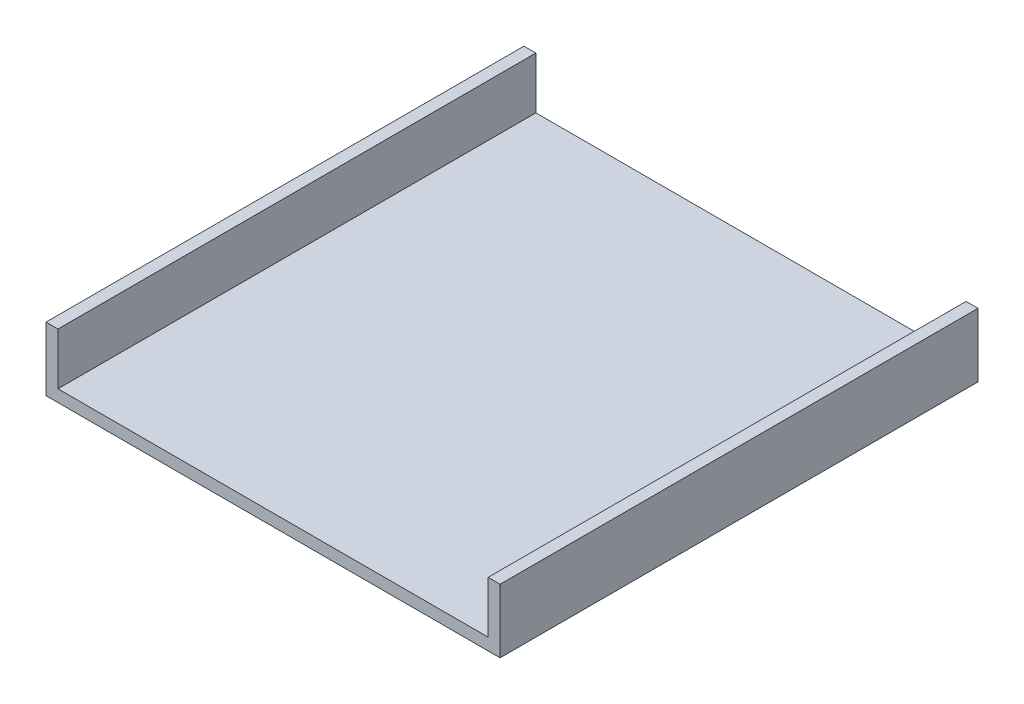
ISO-10303-21;
HEADER;
FILE_DESCRIPTION(('STEP AP214'),'2;1');
FILE_NAME('part.step','',(''),(''),'','','');
FILE_SCHEMA(('AUTOMOTIVE_DESIGN { 1 0 10303 214 1 1 1 1 }'));
ENDSEC;
DATA;
#1=APPLICATION_CONTEXT('core data for automotive mechanical design processes');
#2=APPLICATION_PROTOCOL_DEFINITION('international standard','automotive_design',2000,#1);
#3=PRODUCT_CONTEXT('',#1,'mechanical');
#4=PRODUCT('Part','Part','',(#3));
#5=PRODUCT_RELATED_PRODUCT_CATEGORY('part','',(#4));
#6=PRODUCT_DEFINITION_FORMATION('','',#4);
#7=PRODUCT_DEFINITION_CONTEXT('part definition',#1,'design');
#8=PRODUCT_DEFINITION('design','',#6,#7);
#9=PRODUCT_DEFINITION_SHAPE('','',#8);
#10=(LENGTH_UNIT() NAMED_UNIT(*) SI_UNIT(.MILLI.,.METRE.));
#11=(NAMED_UNIT(*) PLANE_ANGLE_UNIT() SI_UNIT($,.RADIAN.));
#12=(NAMED_UNIT(*) SI_UNIT($,.STERADIAN.) SOLID_ANGLE_UNIT());
#13=UNCERTAINTY_MEASURE_WITH_UNIT(LENGTH_MEASURE(1.E-05),#10,'distance_accuracy_value','');
#14=(GEOMETRIC_REPRESENTATION_CONTEXT(3) GLOBAL_UNCERTAINTY_ASSIGNED_CONTEXT((#13)) GLOBAL_UNIT_ASSIGNED_CONTEXT((#10,
#11,#12)) REPRESENTATION_CONTEXT('',''));
#15=CARTESIAN_POINT('',(0.,0.,0.));
#16=DIRECTION('',(0.,0.,1.));
#17=DIRECTION('',(1.,0.,0.));
#18=AXIS2_PLACEMENT_3D('',#15,#16,#17);
#19=CARTESIAN_POINT('',(57.,8.00000000000001,-60.));
#20=DIRECTION('',(0.,1.,0.));
#21=DIRECTION('',(-1.,0.,0.));
#22=AXIS2_PLACEMENT_3D('',#19,#20,#21);
#23=PLANE('',#22);
#24=DIRECTION('',(0.,0.,-1.));
#25=VECTOR('',#24,1.);
#26=CARTESIAN_POINT('',(54.,8.00000000000001,-60.));
#27=LINE('',#26,#25);
#28=CARTESIAN_POINT('',(54.,8.00000000000001,60.));
#29=VERTEX_POINT('',#28);
#30=CARTESIAN_POINT('',(54.,8.00000000000001,-60.));
#31=VERTEX_POINT('',#30);
#32=EDGE_CURVE('E130',#29,#31,#27,.T.);
#33=ORIENTED_EDGE('',*,*,#32,.F.);
#34=DIRECTION('',(-1.,0.,0.));
#35=VECTOR('',#34,1.);
#36=CARTESIAN_POINT('',(57.,8.00000000000001,60.));
#37=LINE('',#36,#35);
#38=CARTESIAN_POINT('',(57.,8.00000000000001,60.));
#39=VERTEX_POINT('',#38);
#40=EDGE_CURVE('E142',#39,#29,#37,.T.);
#41=ORIENTED_EDGE('',*,*,#40,.F.);
#42=DIRECTION('',(0.,0.,1.));
#43=VECTOR('',#42,1.);
#44=CARTESIAN_POINT('',(57.,8.00000000000001,-60.));
#45=LINE('',#44,#43);
#46=CARTESIAN_POINT('',(57.,8.00000000000001,-60.));
#47=VERTEX_POINT('',#46);
#48=EDGE_CURVE('E159',#47,#39,#45,.T.);
#49=ORIENTED_EDGE('',*,*,#48,.F.);
#50=DIRECTION('',(-1.,0.,0.));
#51=VECTOR('',#50,1.);
#52=CARTESIAN_POINT('',(57.,8.00000000000001,-60.));
#53=LINE('',#52,#51);
#54=EDGE_CURVE('E154',#47,#31,#53,.T.);
#55=ORIENTED_EDGE('',*,*,#54,.T.);
#56=EDGE_LOOP('',(#33,#41,#49,#55));
#57=FACE_BOUND('',#56,.T.);
#58=ADVANCED_FACE('F38',(#57),#23,.T.);
#59=CARTESIAN_POINT('',(-57.,-8.00000000000001,-60.));
#60=DIRECTION('',(-1.,0.,0.));
#61=DIRECTION('',(0.,0.,1.));
#62=AXIS2_PLACEMENT_3D('',#59,#60,#61);
#63=PLANE('',#62);
#64=DIRECTION('',(0.,0.,1.));
#65=VECTOR('',#64,1.);
#66=CARTESIAN_POINT('',(-57.,-8.00000000000001,-60.));
#67=LINE('',#66,#65);
#68=CARTESIAN_POINT('',(-57.,-8.00000000000001,-60.));
#69=VERTEX_POINT('',#68);
#70=CARTESIAN_POINT('',(-57.,-8.00000000000001,60.));
#71=VERTEX_POINT('',#70);
#72=EDGE_CURVE('E157',#69,#71,#67,.T.);
#73=ORIENTED_EDGE('',*,*,#72,.T.);
#74=DIRECTION('',(0.,-1.,0.));
#75=VECTOR('',#74,1.);
#76=CARTESIAN_POINT('',(-57.,-8.00000000000001,60.));
#77=LINE('',#76,#75);
#78=CARTESIAN_POINT('',(-57.,7.99999999999999,60.));
#79=VERTEX_POINT('',#78);
#80=EDGE_CURVE('E132',#79,#71,#77,.T.);
#81=ORIENTED_EDGE('',*,*,#80,.F.);
#82=DIRECTION('',(0.,0.,1.));
#83=VECTOR('',#82,1.);
#84=CARTESIAN_POINT('',(-57.,7.99999999999999,-60.));
#85=LINE('',#84,#83);
#86=CARTESIAN_POINT('',(-57.,7.99999999999999,-60.));
#87=VERTEX_POINT('',#86);
#88=EDGE_CURVE('E46',#87,#79,#85,.T.);
#89=ORIENTED_EDGE('',*,*,#88,.F.);
#90=DIRECTION('',(0.,-1.,0.));
#91=VECTOR('',#90,1.);
#92=CARTESIAN_POINT('',(-57.,-8.00000000000001,-60.));
#93=LINE('',#92,#91);
#94=EDGE_CURVE('E145',#87,#69,#93,.T.);
#95=ORIENTED_EDGE('',*,*,#94,.T.);
#96=EDGE_LOOP('',(#73,#81,#89,#95));
#97=FACE_BOUND('',#96,.T.);
#98=ADVANCED_FACE('F40',(#97),#63,.T.);
#99=DIRECTION('',(0.,0.,1.));
#100=VECTOR('',#99,1.);
#101=CARTESIAN_POINT('',(-54.,7.99999999999999,-60.));
#102=LINE('',#101,#100);
#103=CARTESIAN_POINT('',(-54.,8.00000000000001,-60.));
#104=VERTEX_POINT('',#103);
#105=CARTESIAN_POINT('',(-54.,7.99999999999999,60.));
#106=VERTEX_POINT('',#105);
#107=EDGE_CURVE('E52',#104,#106,#102,.T.);
#108=ORIENTED_EDGE('',*,*,#107,.F.);
#109=EDGE_CURVE('E59',#104,#87,#53,.T.);
#110=ORIENTED_EDGE('',*,*,#109,.T.);
#111=ORIENTED_EDGE('',*,*,#88,.T.);
#112=EDGE_CURVE('E141',#106,#79,#37,.T.);
#113=ORIENTED_EDGE('',*,*,#112,.F.);
#114=EDGE_LOOP('',(#108,#110,#111,#113));
#115=FACE_BOUND('',#114,.T.);
#116=ADVANCED_FACE('F173',(#115),#23,.T.);
#117=CARTESIAN_POINT('',(57.,-7.99999999999999,-60.));
#118=DIRECTION('',(1.,0.,0.));
#119=DIRECTION('',(0.,0.,-1.));
#120=AXIS2_PLACEMENT_3D('',#117,#118,#119);
#121=PLANE('',#120);
#122=ORIENTED_EDGE('',*,*,#48,.T.);
#123=DIRECTION('',(0.,1.,0.));
#124=VECTOR('',#123,1.);
#125=CARTESIAN_POINT('',(57.,-7.99999999999999,60.));
#126=LINE('',#125,#124);
#127=CARTESIAN_POINT('',(57.,-7.99999999999999,60.));
#128=VERTEX_POINT('',#127);
#129=EDGE_CURVE('E138',#128,#39,#126,.T.);
#130=ORIENTED_EDGE('',*,*,#129,.F.);
#131=DIRECTION('',(0.,0.,1.));
#132=VECTOR('',#131,1.);
#133=CARTESIAN_POINT('',(57.,-7.99999999999999,-60.));
#134=LINE('',#133,#132);
#135=CARTESIAN_POINT('',(57.,-7.99999999999999,-60.));
#136=VERTEX_POINT('',#135);
#137=EDGE_CURVE('E161',#136,#128,#134,.T.);
#138=ORIENTED_EDGE('',*,*,#137,.F.);
#139=DIRECTION('',(0.,1.,0.));
#140=VECTOR('',#139,1.);
#141=CARTESIAN_POINT('',(57.,-7.99999999999999,-60.));
#142=LINE('',#141,#140);
#143=EDGE_CURVE('E151',#136,#47,#142,.T.);
#144=ORIENTED_EDGE('',*,*,#143,.T.);
#145=EDGE_LOOP('',(#122,#130,#138,#144));
#146=FACE_BOUND('',#145,.T.);
#147=ADVANCED_FACE('F177',(#146),#121,.T.);
#148=CARTESIAN_POINT('',(57.,-7.99999999999999,-60.));
#149=DIRECTION('',(0.,-1.,0.));
#150=DIRECTION('',(1.,0.,0.));
#151=AXIS2_PLACEMENT_3D('',#148,#149,#150);
#152=PLANE('',#151);
#153=ORIENTED_EDGE('',*,*,#137,.T.);
#154=DIRECTION('',(1.,0.,0.));
#155=VECTOR('',#154,1.);
#156=CARTESIAN_POINT('',(57.,-7.99999999999999,60.));
#157=LINE('',#156,#155);
#158=EDGE_CURVE('E135',#71,#128,#157,.T.);
#159=ORIENTED_EDGE('',*,*,#158,.F.);
#160=ORIENTED_EDGE('',*,*,#72,.F.);
#161=DIRECTION('',(1.,0.,0.));
#162=VECTOR('',#161,1.);
#163=CARTESIAN_POINT('',(57.,-7.99999999999999,-60.));
#164=LINE('',#163,#162);
#165=EDGE_CURVE('E148',#69,#136,#164,.T.);
#166=ORIENTED_EDGE('',*,*,#165,.T.);
#167=EDGE_LOOP('',(#153,#159,#160,#166));
#168=FACE_BOUND('',#167,.T.);
#169=ADVANCED_FACE('F167',(#168),#152,.T.);
#170=CARTESIAN_POINT('',(0.,0.,-60.));
#171=DIRECTION('',(0.,0.,1.));
#172=DIRECTION('',(1.,0.,0.));
#173=AXIS2_PLACEMENT_3D('',#170,#171,#172);
#174=PLANE('',#173);
#175=DIRECTION('',(1.,0.,0.));
#176=VECTOR('',#175,1.);
#177=CARTESIAN_POINT('',(-54.,-5.00000000000001,-60.));
#178=LINE('',#177,#176);
#179=CARTESIAN_POINT('',(-54.,-5.00000000000001,-60.));
#180=VERTEX_POINT('',#179);
#181=CARTESIAN_POINT('',(54.,-5.00000000000001,-60.));
#182=VERTEX_POINT('',#181);
#183=EDGE_CURVE('E110',#180,#182,#178,.T.);
#184=ORIENTED_EDGE('',*,*,#183,.T.);
#185=DIRECTION('',(0.,1.,0.));
#186=VECTOR('',#185,1.);
#187=CARTESIAN_POINT('',(54.,21.,-60.));
#188=LINE('',#187,#186);
#189=EDGE_CURVE('E120',#182,#31,#188,.T.);
#190=ORIENTED_EDGE('',*,*,#189,.T.);
#191=ORIENTED_EDGE('',*,*,#54,.F.);
#192=ORIENTED_EDGE('',*,*,#143,.F.);
#193=ORIENTED_EDGE('',*,*,#165,.F.);
#194=ORIENTED_EDGE('',*,*,#94,.F.);
#195=ORIENTED_EDGE('',*,*,#109,.F.);
#196=DIRECTION('',(0.,-1.,0.));
#197=VECTOR('',#196,1.);
#198=CARTESIAN_POINT('',(-54.,21.,-60.));
#199=LINE('',#198,#197);
#200=EDGE_CURVE('E105',#104,#180,#199,.T.);
#201=ORIENTED_EDGE('',*,*,#200,.T.);
#202=EDGE_LOOP('',(#184,#190,#191,#192,#193,#194,#195,#201));
#203=FACE_BOUND('',#202,.T.);
#204=ADVANCED_FACE('F118',(#203),#174,.F.);
#205=CARTESIAN_POINT('',(0.,0.,60.));
#206=DIRECTION('',(0.,0.,1.));
#207=DIRECTION('',(1.,0.,0.));
#208=AXIS2_PLACEMENT_3D('',#205,#206,#207);
#209=PLANE('',#208);
#210=DIRECTION('',(0.,1.,0.));
#211=VECTOR('',#210,1.);
#212=CARTESIAN_POINT('',(54.,21.,60.));
#213=LINE('',#212,#211);
#214=CARTESIAN_POINT('',(54.,-5.00000000000001,60.));
#215=VERTEX_POINT('',#214);
#216=EDGE_CURVE('E125',#215,#29,#213,.T.);
#217=ORIENTED_EDGE('',*,*,#216,.F.);
#218=DIRECTION('',(1.,0.,0.));
#219=VECTOR('',#218,1.);
#220=CARTESIAN_POINT('',(-54.,-5.00000000000001,60.));
#221=LINE('',#220,#219);
#222=CARTESIAN_POINT('',(-54.,-5.00000000000001,60.));
#223=VERTEX_POINT('',#222);
#224=EDGE_CURVE('E122',#223,#215,#221,.T.);
#225=ORIENTED_EDGE('',*,*,#224,.F.);
#226=DIRECTION('',(0.,-1.,0.));
#227=VECTOR('',#226,1.);
#228=CARTESIAN_POINT('',(-54.,0.,60.));
#229=LINE('',#228,#227);
#230=EDGE_CURVE('E11',#106,#223,#229,.T.);
#231=ORIENTED_EDGE('',*,*,#230,.F.);
#232=ORIENTED_EDGE('',*,*,#112,.T.);
#233=ORIENTED_EDGE('',*,*,#80,.T.);
#234=ORIENTED_EDGE('',*,*,#158,.T.);
#235=ORIENTED_EDGE('',*,*,#129,.T.);
#236=ORIENTED_EDGE('',*,*,#40,.T.);
#237=EDGE_LOOP('',(#217,#225,#231,#232,#233,#234,#235,#236));
#238=FACE_BOUND('',#237,.T.);
#239=ADVANCED_FACE('F171',(#238),#209,.T.);
#240=CARTESIAN_POINT('',(54.,21.,-60.));
#241=DIRECTION('',(1.,0.,0.));
#242=DIRECTION('',(0.,0.,-1.));
#243=AXIS2_PLACEMENT_3D('',#240,#241,#242);
#244=PLANE('',#243);
#245=ORIENTED_EDGE('',*,*,#32,.T.);
#246=ORIENTED_EDGE('',*,*,#189,.F.);
#247=DIRECTION('',(0.,0.,1.));
#248=VECTOR('',#247,1.);
#249=CARTESIAN_POINT('',(54.,-5.00000000000001,-60.));
#250=LINE('',#249,#248);
#251=EDGE_CURVE('E109',#182,#215,#250,.T.);
#252=ORIENTED_EDGE('',*,*,#251,.T.);
#253=ORIENTED_EDGE('',*,*,#216,.T.);
#254=EDGE_LOOP('',(#245,#246,#252,#253));
#255=FACE_BOUND('',#254,.T.);
#256=ADVANCED_FACE('F182',(#255),#244,.F.);
#257=CARTESIAN_POINT('',(-54.,-5.00000000000001,-60.));
#258=DIRECTION('',(0.,-1.,0.));
#259=DIRECTION('',(0.,0.,-1.));
#260=AXIS2_PLACEMENT_3D('',#257,#258,#259);
#261=PLANE('',#260);
#262=ORIENTED_EDGE('',*,*,#224,.T.);
#263=ORIENTED_EDGE('',*,*,#251,.F.);
#264=ORIENTED_EDGE('',*,*,#183,.F.);
#265=DIRECTION('',(0.,0.,1.));
#266=VECTOR('',#265,1.);
#267=CARTESIAN_POINT('',(-54.,-5.00000000000001,-60.));
#268=LINE('',#267,#266);
#269=EDGE_CURVE('E101',#180,#223,#268,.T.);
#270=ORIENTED_EDGE('',*,*,#269,.T.);
#271=EDGE_LOOP('',(#262,#263,#264,#270));
#272=FACE_BOUND('',#271,.T.);
#273=ADVANCED_FACE('F113',(#272),#261,.F.);
#274=CARTESIAN_POINT('',(-54.,21.,-60.));
#275=DIRECTION('',(-1.,0.,0.));
#276=DIRECTION('',(0.,0.,1.));
#277=AXIS2_PLACEMENT_3D('',#274,#275,#276);
#278=PLANE('',#277);
#279=ORIENTED_EDGE('',*,*,#107,.T.);
#280=ORIENTED_EDGE('',*,*,#230,.T.);
#281=ORIENTED_EDGE('',*,*,#269,.F.);
#282=ORIENTED_EDGE('',*,*,#200,.F.);
#283=EDGE_LOOP('',(#279,#280,#281,#282));
#284=FACE_BOUND('',#283,.T.);
#285=ADVANCED_FACE('F103',(#284),#278,.F.);
#286=CLOSED_SHELL('',(#58,#98,#116,#147,#169,#204,#239,#256,#273,#285));
#287=MANIFOLD_SOLID_BREP('B2',#286);
#288=ADVANCED_BREP_SHAPE_REPRESENTATION('',(#18,#287),#14);
#289=SHAPE_DEFINITION_REPRESENTATION(#9,#288);
ENDSEC;
END-ISO-10303-21;
